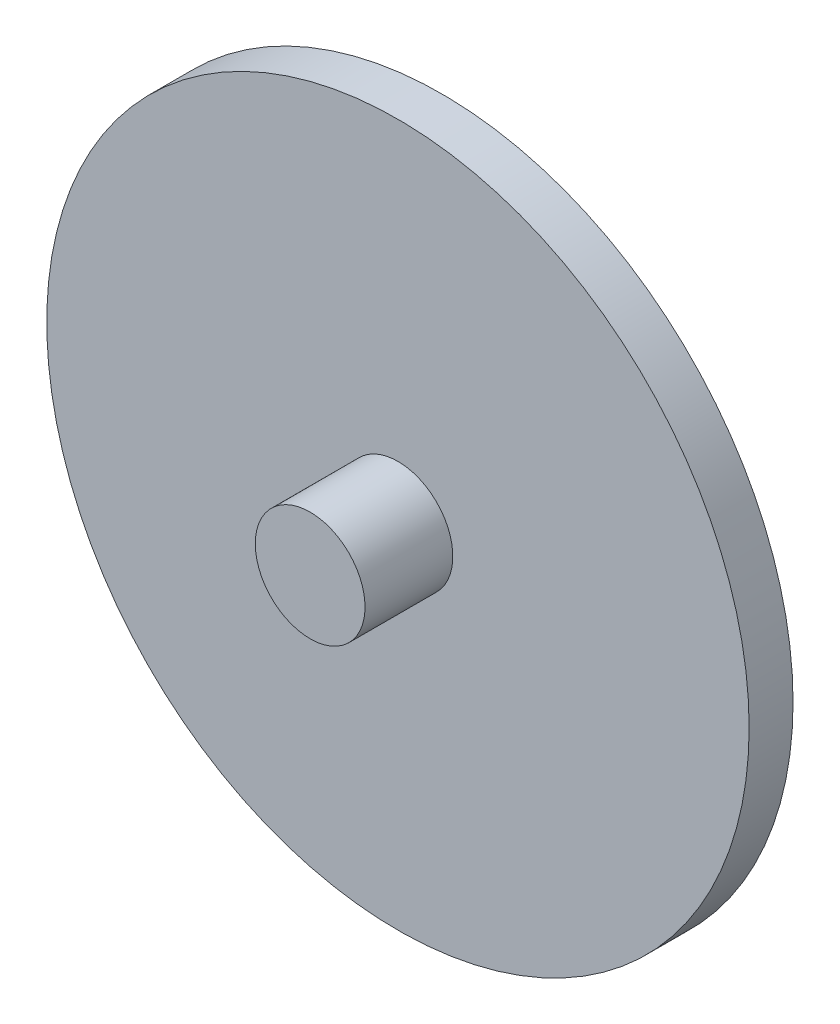
ISO-10303-21;
HEADER;
FILE_DESCRIPTION(('STEP AP214'),'2;1');
FILE_NAME('part.step','',(''),(''),'','','');
FILE_SCHEMA(('AUTOMOTIVE_DESIGN { 1 0 10303 214 1 1 1 1 }'));
ENDSEC;
DATA;
#1=APPLICATION_CONTEXT('core data for automotive mechanical design processes');
#2=APPLICATION_PROTOCOL_DEFINITION('international standard','automotive_design',2000,#1);
#3=PRODUCT_CONTEXT('',#1,'mechanical');
#4=PRODUCT('Part','Part','',(#3));
#5=PRODUCT_RELATED_PRODUCT_CATEGORY('part','',(#4));
#6=PRODUCT_DEFINITION_FORMATION('','',#4);
#7=PRODUCT_DEFINITION_CONTEXT('part definition',#1,'design');
#8=PRODUCT_DEFINITION('design','',#6,#7);
#9=PRODUCT_DEFINITION_SHAPE('','',#8);
#10=(LENGTH_UNIT() NAMED_UNIT(*) SI_UNIT(.MILLI.,.METRE.));
#11=(NAMED_UNIT(*) PLANE_ANGLE_UNIT() SI_UNIT($,.RADIAN.));
#12=(NAMED_UNIT(*) SI_UNIT($,.STERADIAN.) SOLID_ANGLE_UNIT());
#13=UNCERTAINTY_MEASURE_WITH_UNIT(LENGTH_MEASURE(1.E-05),#10,'distance_accuracy_value','');
#14=(GEOMETRIC_REPRESENTATION_CONTEXT(3) GLOBAL_UNCERTAINTY_ASSIGNED_CONTEXT((#13)) GLOBAL_UNIT_ASSIGNED_CONTEXT((#10,
#11,#12)) REPRESENTATION_CONTEXT('',''));
#15=CARTESIAN_POINT('',(0.,0.,0.));
#16=DIRECTION('',(0.,0.,1.));
#17=DIRECTION('',(1.,0.,0.));
#18=AXIS2_PLACEMENT_3D('',#15,#16,#17);
#19=CARTESIAN_POINT('',(-196.682719320133,-420.602297752566,-810.486147986319));
#20=DIRECTION('',(0.,0.,1.));
#21=DIRECTION('',(1.,0.,0.));
#22=AXIS2_PLACEMENT_3D('',#19,#20,#21);
#23=PLANE('',#22);
#24=CARTESIAN_POINT('',(-196.682719320133,-420.602297752566,-810.486147986319));
#25=DIRECTION('',(0.,0.,-1.));
#26=DIRECTION('',(-1.,0.,0.));
#27=AXIS2_PLACEMENT_3D('',#24,#25,#26);
#28=CIRCLE('',#27,12.5);
#29=CARTESIAN_POINT('',(-209.182719320133,-420.602297752566,-810.486147986319));
#30=VERTEX_POINT('',#29);
#31=EDGE_CURVE('E18',#30,#30,#28,.T.);
#32=ORIENTED_EDGE('',*,*,#31,.F.);
#33=EDGE_LOOP('',(#32));
#34=FACE_BOUND('',#33,.T.);
#35=ADVANCED_FACE('F15',(#34),#23,.T.);
#36=CARTESIAN_POINT('',(-196.682719320133,-420.602297752566,-810.486147986319));
#37=DIRECTION('',(0.,0.,-1.));
#38=DIRECTION('',(-1.,0.,0.));
#39=AXIS2_PLACEMENT_3D('',#36,#37,#38);
#40=CYLINDRICAL_SURFACE('',#39,12.5);
#41=CARTESIAN_POINT('',(-196.682719320133,-420.602297752566,-830.48614798632));
#42=DIRECTION('',(0.,0.,-1.));
#43=DIRECTION('',(-1.,0.,0.));
#44=AXIS2_PLACEMENT_3D('',#41,#42,#43);
#45=CIRCLE('',#44,12.5);
#46=CARTESIAN_POINT('',(-209.182719320133,-420.602297752566,-830.48614798632));
#47=VERTEX_POINT('',#46);
#48=EDGE_CURVE('E31',#47,#47,#45,.T.);
#49=ORIENTED_EDGE('',*,*,#48,.F.);
#50=EDGE_LOOP('',(#49));
#51=FACE_BOUND('',#50,.T.);
#52=ORIENTED_EDGE('',*,*,#31,.T.);
#53=EDGE_LOOP('',(#52));
#54=FACE_BOUND('',#53,.T.);
#55=ADVANCED_FACE('F40',(#51,#54),#40,.T.);
#56=CARTESIAN_POINT('',(-196.682719320133,-420.602297752566,-830.48614798632));
#57=DIRECTION('',(0.,0.,1.));
#58=DIRECTION('',(1.,0.,0.));
#59=AXIS2_PLACEMENT_3D('',#56,#57,#58);
#60=PLANE('',#59);
#61=ORIENTED_EDGE('',*,*,#48,.T.);
#62=EDGE_LOOP('',(#61));
#63=FACE_BOUND('',#62,.T.);
#64=CARTESIAN_POINT('',(-196.682719320133,-420.602297752566,-830.48614798632));
#65=DIRECTION('',(0.,0.,1.));
#66=DIRECTION('',(1.,0.,0.));
#67=AXIS2_PLACEMENT_3D('',#64,#65,#66);
#68=CIRCLE('',#67,80.);
#69=CARTESIAN_POINT('',(-116.682719320133,-420.602297752566,-830.48614798632));
#70=VERTEX_POINT('',#69);
#71=EDGE_CURVE('E23',#70,#70,#68,.F.);
#72=ORIENTED_EDGE('',*,*,#71,.F.);
#73=EDGE_LOOP('',(#72));
#74=FACE_BOUND('',#73,.T.);
#75=ADVANCED_FACE('F46',(#63,#74),#60,.T.);
#76=CARTESIAN_POINT('',(-196.682719320133,-420.602297752566,-835.486147986318));
#77=DIRECTION('',(0.,0.,1.));
#78=DIRECTION('',(1.,0.,0.));
#79=AXIS2_PLACEMENT_3D('',#76,#77,#78);
#80=CYLINDRICAL_SURFACE('',#79,80.);
#81=CARTESIAN_POINT('',(-196.682719320133,-420.602297752566,-840.486147986318));
#82=DIRECTION('',(0.,0.,1.));
#83=DIRECTION('',(1.,0.,0.));
#84=AXIS2_PLACEMENT_3D('',#81,#82,#83);
#85=CIRCLE('',#84,80.);
#86=CARTESIAN_POINT('',(-116.682719320133,-420.602297752566,-840.486147986318));
#87=VERTEX_POINT('',#86);
#88=EDGE_CURVE('E10',#87,#87,#85,.F.);
#89=ORIENTED_EDGE('',*,*,#88,.F.);
#90=EDGE_LOOP('',(#89));
#91=FACE_BOUND('',#90,.T.);
#92=ORIENTED_EDGE('',*,*,#71,.T.);
#93=EDGE_LOOP('',(#92));
#94=FACE_BOUND('',#93,.T.);
#95=ADVANCED_FACE('F50',(#91,#94),#80,.T.);
#96=CARTESIAN_POINT('',(-196.682719320133,-420.602297752566,-840.486147986318));
#97=DIRECTION('',(0.,0.,-1.));
#98=DIRECTION('',(-1.,0.,0.));
#99=AXIS2_PLACEMENT_3D('',#96,#97,#98);
#100=PLANE('',#99);
#101=ORIENTED_EDGE('',*,*,#88,.T.);
#102=EDGE_LOOP('',(#101));
#103=FACE_BOUND('',#102,.T.);
#104=ADVANCED_FACE('F48',(#103),#100,.T.);
#105=CLOSED_SHELL('',(#35,#55,#75,#95,#104));
#106=MANIFOLD_SOLID_BREP('B1',#105);
#107=ADVANCED_BREP_SHAPE_REPRESENTATION('',(#18,#106),#14);
#108=SHAPE_DEFINITION_REPRESENTATION(#9,#107);
ENDSEC;
END-ISO-10303-21;
